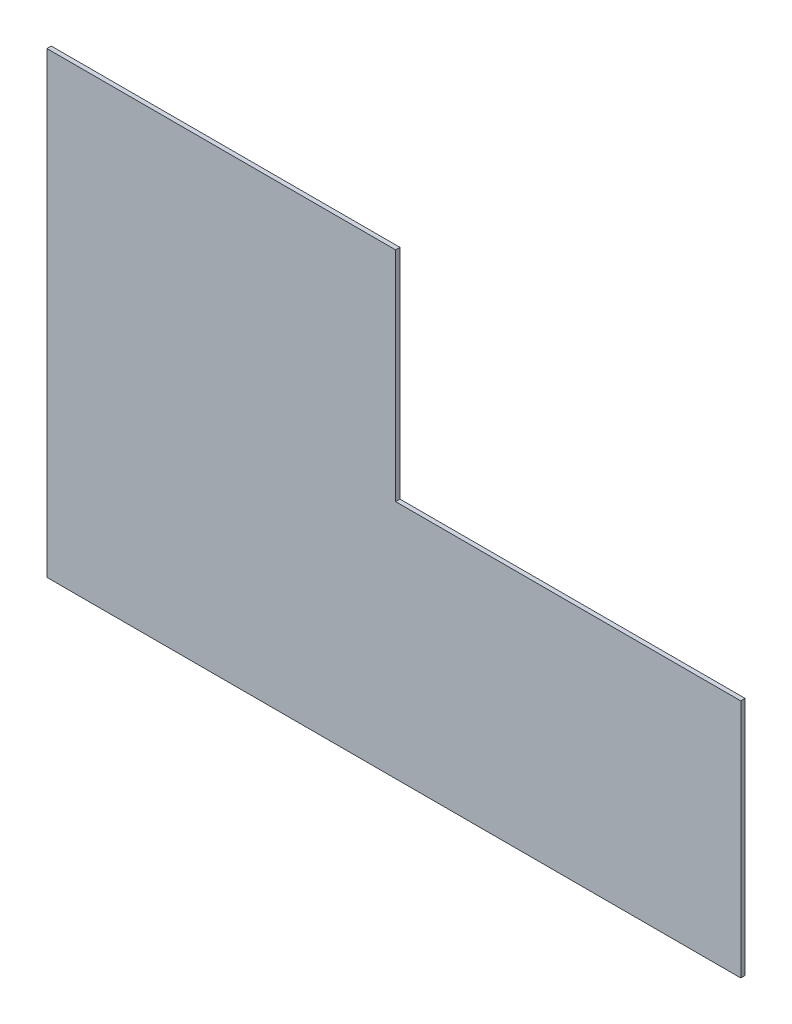
ISO-10303-21;
HEADER;
FILE_DESCRIPTION(('STEP AP214'),'2;1');
FILE_NAME('part.step','',(''),(''),'','','');
FILE_SCHEMA(('AUTOMOTIVE_DESIGN { 1 0 10303 214 1 1 1 1 }'));
ENDSEC;
DATA;
#1=APPLICATION_CONTEXT('core data for automotive mechanical design processes');
#2=APPLICATION_PROTOCOL_DEFINITION('international standard','automotive_design',2000,#1);
#3=PRODUCT_CONTEXT('',#1,'mechanical');
#4=PRODUCT('Part','Part','',(#3));
#5=PRODUCT_RELATED_PRODUCT_CATEGORY('part','',(#4));
#6=PRODUCT_DEFINITION_FORMATION('','',#4);
#7=PRODUCT_DEFINITION_CONTEXT('part definition',#1,'design');
#8=PRODUCT_DEFINITION('design','',#6,#7);
#9=PRODUCT_DEFINITION_SHAPE('','',#8);
#10=(LENGTH_UNIT() NAMED_UNIT(*) SI_UNIT(.MILLI.,.METRE.));
#11=(NAMED_UNIT(*) PLANE_ANGLE_UNIT() SI_UNIT($,.RADIAN.));
#12=(NAMED_UNIT(*) SI_UNIT($,.STERADIAN.) SOLID_ANGLE_UNIT());
#13=UNCERTAINTY_MEASURE_WITH_UNIT(LENGTH_MEASURE(1.E-05),#10,'distance_accuracy_value','');
#14=(GEOMETRIC_REPRESENTATION_CONTEXT(3) GLOBAL_UNCERTAINTY_ASSIGNED_CONTEXT((#13)) GLOBAL_UNIT_ASSIGNED_CONTEXT((#10,
#11,#12)) REPRESENTATION_CONTEXT('',''));
#15=CARTESIAN_POINT('',(0.,0.,0.));
#16=DIRECTION('',(0.,0.,1.));
#17=DIRECTION('',(1.,0.,0.));
#18=AXIS2_PLACEMENT_3D('',#15,#16,#17);
#19=CARTESIAN_POINT('',(0.,316.5,3.));
#20=DIRECTION('',(1.,0.,0.));
#21=DIRECTION('',(0.,1.,0.));
#22=AXIS2_PLACEMENT_3D('',#19,#20,#21);
#23=PLANE('',#22);
#24=DIRECTION('',(0.,-1.,0.));
#25=VECTOR('',#24,1.);
#26=CARTESIAN_POINT('',(0.,316.5,0.));
#27=LINE('',#26,#25);
#28=CARTESIAN_POINT('',(0.,316.5,0.));
#29=VERTEX_POINT('',#28);
#30=CARTESIAN_POINT('',(0.,0.,0.));
#31=VERTEX_POINT('',#30);
#32=EDGE_CURVE('E128',#29,#31,#27,.T.);
#33=ORIENTED_EDGE('',*,*,#32,.T.);
#34=DIRECTION('',(0.,0.,-1.));
#35=VECTOR('',#34,1.);
#36=CARTESIAN_POINT('',(0.,0.,3.));
#37=LINE('',#36,#35);
#38=CARTESIAN_POINT('',(0.,0.,3.));
#39=VERTEX_POINT('',#38);
#40=EDGE_CURVE('E11',#39,#31,#37,.T.);
#41=ORIENTED_EDGE('',*,*,#40,.F.);
#42=DIRECTION('',(0.,-1.,0.));
#43=VECTOR('',#42,1.);
#44=CARTESIAN_POINT('',(0.,316.5,3.));
#45=LINE('',#44,#43);
#46=CARTESIAN_POINT('',(0.,316.5,3.));
#47=VERTEX_POINT('',#46);
#48=EDGE_CURVE('E144',#47,#39,#45,.T.);
#49=ORIENTED_EDGE('',*,*,#48,.F.);
#50=DIRECTION('',(0.,0.,-1.));
#51=VECTOR('',#50,1.);
#52=CARTESIAN_POINT('',(0.,316.5,3.));
#53=LINE('',#52,#51);
#54=EDGE_CURVE('E124',#47,#29,#53,.T.);
#55=ORIENTED_EDGE('',*,*,#54,.T.);
#56=EDGE_LOOP('',(#33,#41,#49,#55));
#57=FACE_BOUND('',#56,.T.);
#58=ADVANCED_FACE('F39',(#57),#23,.F.);
#59=CARTESIAN_POINT('',(0.,0.,3.));
#60=DIRECTION('',(0.,1.,0.));
#61=DIRECTION('',(0.,0.,1.));
#62=AXIS2_PLACEMENT_3D('',#59,#60,#61);
#63=PLANE('',#62);
#64=DIRECTION('',(1.,0.,0.));
#65=VECTOR('',#64,1.);
#66=CARTESIAN_POINT('',(0.,0.,0.));
#67=LINE('',#66,#65);
#68=CARTESIAN_POINT('',(479.5,0.,0.));
#69=VERTEX_POINT('',#68);
#70=EDGE_CURVE('E132',#31,#69,#67,.T.);
#71=ORIENTED_EDGE('',*,*,#70,.T.);
#72=DIRECTION('',(0.,0.,-1.));
#73=VECTOR('',#72,1.);
#74=CARTESIAN_POINT('',(479.5,0.,3.));
#75=LINE('',#74,#73);
#76=CARTESIAN_POINT('',(479.5,0.,3.));
#77=VERTEX_POINT('',#76);
#78=EDGE_CURVE('E48',#77,#69,#75,.T.);
#79=ORIENTED_EDGE('',*,*,#78,.F.);
#80=DIRECTION('',(1.,0.,0.));
#81=VECTOR('',#80,1.);
#82=CARTESIAN_POINT('',(0.,0.,3.));
#83=LINE('',#82,#81);
#84=EDGE_CURVE('E93',#39,#77,#83,.T.);
#85=ORIENTED_EDGE('',*,*,#84,.F.);
#86=ORIENTED_EDGE('',*,*,#40,.T.);
#87=EDGE_LOOP('',(#71,#79,#85,#86));
#88=FACE_BOUND('',#87,.T.);
#89=ADVANCED_FACE('F172',(#88),#63,.F.);
#90=CARTESIAN_POINT('',(479.5,0.,3.));
#91=DIRECTION('',(-1.,0.,0.));
#92=DIRECTION('',(0.,0.,1.));
#93=AXIS2_PLACEMENT_3D('',#90,#91,#92);
#94=PLANE('',#93);
#95=DIRECTION('',(0.,1.,0.));
#96=VECTOR('',#95,1.);
#97=CARTESIAN_POINT('',(479.5,0.,0.));
#98=LINE('',#97,#96);
#99=CARTESIAN_POINT('',(479.5,165.84,0.));
#100=VERTEX_POINT('',#99);
#101=EDGE_CURVE('E135',#69,#100,#98,.T.);
#102=ORIENTED_EDGE('',*,*,#101,.T.);
#103=DIRECTION('',(0.,0.,-1.));
#104=VECTOR('',#103,1.);
#105=CARTESIAN_POINT('',(479.5,165.84,3.));
#106=LINE('',#105,#104);
#107=CARTESIAN_POINT('',(479.5,165.84,3.));
#108=VERTEX_POINT('',#107);
#109=EDGE_CURVE('E117',#108,#100,#106,.T.);
#110=ORIENTED_EDGE('',*,*,#109,.F.);
#111=DIRECTION('',(0.,1.,0.));
#112=VECTOR('',#111,1.);
#113=CARTESIAN_POINT('',(479.5,0.,3.));
#114=LINE('',#113,#112);
#115=EDGE_CURVE('E106',#77,#108,#114,.T.);
#116=ORIENTED_EDGE('',*,*,#115,.F.);
#117=ORIENTED_EDGE('',*,*,#78,.T.);
#118=EDGE_LOOP('',(#102,#110,#116,#117));
#119=FACE_BOUND('',#118,.T.);
#120=ADVANCED_FACE('F154',(#119),#94,.F.);
#121=CARTESIAN_POINT('',(479.5,165.84,3.));
#122=DIRECTION('',(0.,-1.,0.));
#123=DIRECTION('',(1.,0.,0.));
#124=AXIS2_PLACEMENT_3D('',#121,#122,#123);
#125=PLANE('',#124);
#126=DIRECTION('',(-1.,0.,0.));
#127=VECTOR('',#126,1.);
#128=CARTESIAN_POINT('',(479.5,165.84,0.));
#129=LINE('',#128,#127);
#130=CARTESIAN_POINT('',(241.,165.84,0.));
#131=VERTEX_POINT('',#130);
#132=EDGE_CURVE('E115',#100,#131,#129,.T.);
#133=ORIENTED_EDGE('',*,*,#132,.T.);
#134=DIRECTION('',(0.,0.,-1.));
#135=VECTOR('',#134,1.);
#136=CARTESIAN_POINT('',(241.,165.84,3.));
#137=LINE('',#136,#135);
#138=CARTESIAN_POINT('',(241.,165.84,3.));
#139=VERTEX_POINT('',#138);
#140=EDGE_CURVE('E112',#139,#131,#137,.T.);
#141=ORIENTED_EDGE('',*,*,#140,.F.);
#142=DIRECTION('',(-1.,0.,0.));
#143=VECTOR('',#142,1.);
#144=CARTESIAN_POINT('',(479.5,165.84,3.));
#145=LINE('',#144,#143);
#146=EDGE_CURVE('E100',#108,#139,#145,.T.);
#147=ORIENTED_EDGE('',*,*,#146,.F.);
#148=ORIENTED_EDGE('',*,*,#109,.T.);
#149=EDGE_LOOP('',(#133,#141,#147,#148));
#150=FACE_BOUND('',#149,.T.);
#151=ADVANCED_FACE('F113',(#150),#125,.F.);
#152=CARTESIAN_POINT('',(241.,165.84,3.));
#153=DIRECTION('',(-1.,0.,0.));
#154=DIRECTION('',(0.,0.,1.));
#155=AXIS2_PLACEMENT_3D('',#152,#153,#154);
#156=PLANE('',#155);
#157=DIRECTION('',(0.,1.,0.));
#158=VECTOR('',#157,1.);
#159=CARTESIAN_POINT('',(241.,165.84,0.));
#160=LINE('',#159,#158);
#161=CARTESIAN_POINT('',(241.,316.5,0.));
#162=VERTEX_POINT('',#161);
#163=EDGE_CURVE('E79',#131,#162,#160,.T.);
#164=ORIENTED_EDGE('',*,*,#163,.T.);
#165=DIRECTION('',(0.,0.,-1.));
#166=VECTOR('',#165,1.);
#167=CARTESIAN_POINT('',(241.,316.5,3.));
#168=LINE('',#167,#166);
#169=CARTESIAN_POINT('',(241.,316.5,3.));
#170=VERTEX_POINT('',#169);
#171=EDGE_CURVE('E118',#170,#162,#168,.T.);
#172=ORIENTED_EDGE('',*,*,#171,.F.);
#173=DIRECTION('',(0.,1.,0.));
#174=VECTOR('',#173,1.);
#175=CARTESIAN_POINT('',(241.,165.84,3.));
#176=LINE('',#175,#174);
#177=EDGE_CURVE('E104',#139,#170,#176,.T.);
#178=ORIENTED_EDGE('',*,*,#177,.F.);
#179=ORIENTED_EDGE('',*,*,#140,.T.);
#180=EDGE_LOOP('',(#164,#172,#178,#179));
#181=FACE_BOUND('',#180,.T.);
#182=ADVANCED_FACE('F120',(#181),#156,.F.);
#183=CARTESIAN_POINT('',(241.,316.5,3.));
#184=DIRECTION('',(0.,-1.,0.));
#185=DIRECTION('',(1.,0.,0.));
#186=AXIS2_PLACEMENT_3D('',#183,#184,#185);
#187=PLANE('',#186);
#188=DIRECTION('',(-1.,0.,0.));
#189=VECTOR('',#188,1.);
#190=CARTESIAN_POINT('',(241.,316.5,0.));
#191=LINE('',#190,#189);
#192=EDGE_CURVE('E85',#162,#29,#191,.T.);
#193=ORIENTED_EDGE('',*,*,#192,.T.);
#194=ORIENTED_EDGE('',*,*,#54,.F.);
#195=DIRECTION('',(-1.,0.,0.));
#196=VECTOR('',#195,1.);
#197=CARTESIAN_POINT('',(241.,316.5,3.));
#198=LINE('',#197,#196);
#199=EDGE_CURVE('E56',#170,#47,#198,.T.);
#200=ORIENTED_EDGE('',*,*,#199,.F.);
#201=ORIENTED_EDGE('',*,*,#171,.T.);
#202=EDGE_LOOP('',(#193,#194,#200,#201));
#203=FACE_BOUND('',#202,.T.);
#204=ADVANCED_FACE('F161',(#203),#187,.F.);
#205=CARTESIAN_POINT('',(0.,0.,3.));
#206=DIRECTION('',(0.,0.,1.));
#207=DIRECTION('',(1.,0.,0.));
#208=AXIS2_PLACEMENT_3D('',#205,#206,#207);
#209=PLANE('',#208);
#210=ORIENTED_EDGE('',*,*,#48,.T.);
#211=ORIENTED_EDGE('',*,*,#84,.T.);
#212=ORIENTED_EDGE('',*,*,#115,.T.);
#213=ORIENTED_EDGE('',*,*,#146,.T.);
#214=ORIENTED_EDGE('',*,*,#177,.T.);
#215=ORIENTED_EDGE('',*,*,#199,.T.);
#216=EDGE_LOOP('',(#210,#211,#212,#213,#214,#215));
#217=FACE_BOUND('',#216,.T.);
#218=ADVANCED_FACE('F102',(#217),#209,.T.);
#219=CARTESIAN_POINT('',(0.,0.,0.));
#220=DIRECTION('',(0.,0.,1.));
#221=DIRECTION('',(1.,0.,0.));
#222=AXIS2_PLACEMENT_3D('',#219,#220,#221);
#223=PLANE('',#222);
#224=ORIENTED_EDGE('',*,*,#32,.F.);
#225=ORIENTED_EDGE('',*,*,#192,.F.);
#226=ORIENTED_EDGE('',*,*,#163,.F.);
#227=ORIENTED_EDGE('',*,*,#132,.F.);
#228=ORIENTED_EDGE('',*,*,#101,.F.);
#229=ORIENTED_EDGE('',*,*,#70,.F.);
#230=EDGE_LOOP('',(#224,#225,#226,#227,#228,#229));
#231=FACE_BOUND('',#230,.T.);
#232=ADVANCED_FACE('F157',(#231),#223,.F.);
#233=CLOSED_SHELL('',(#58,#89,#120,#151,#182,#204,#218,#232));
#234=MANIFOLD_SOLID_BREP('B2',#233);
#235=ADVANCED_BREP_SHAPE_REPRESENTATION('',(#18,#234),#14);
#236=SHAPE_DEFINITION_REPRESENTATION(#9,#235);
ENDSEC;
END-ISO-10303-21;
